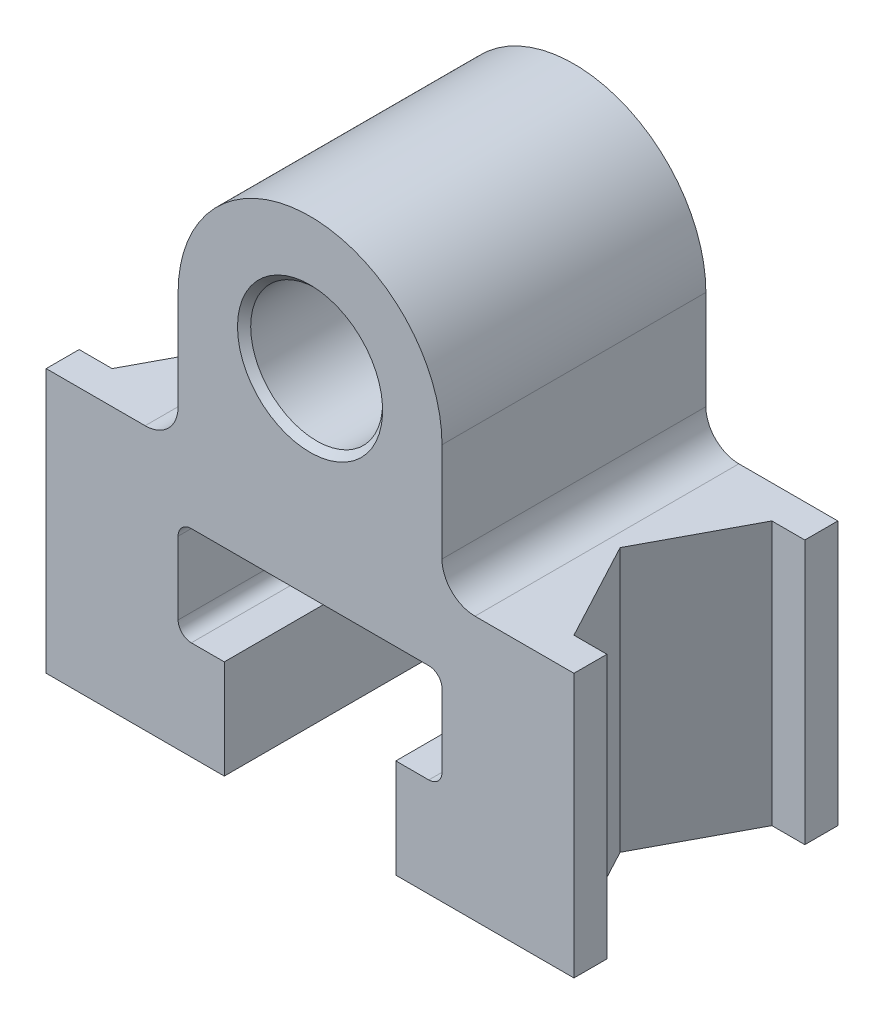
ISO-10303-21;
HEADER;
FILE_DESCRIPTION(('STEP AP214'),'2;1');
FILE_NAME('part.step','',(''),(''),'','','');
FILE_SCHEMA(('AUTOMOTIVE_DESIGN { 1 0 10303 214 1 1 1 1 }'));
ENDSEC;
DATA;
#1=APPLICATION_CONTEXT('core data for automotive mechanical design processes');
#2=APPLICATION_PROTOCOL_DEFINITION('international standard','automotive_design',2000,#1);
#3=PRODUCT_CONTEXT('',#1,'mechanical');
#4=PRODUCT('Part','Part','',(#3));
#5=PRODUCT_RELATED_PRODUCT_CATEGORY('part','',(#4));
#6=PRODUCT_DEFINITION_FORMATION('','',#4);
#7=PRODUCT_DEFINITION_CONTEXT('part definition',#1,'design');
#8=PRODUCT_DEFINITION('design','',#6,#7);
#9=PRODUCT_DEFINITION_SHAPE('','',#8);
#10=(LENGTH_UNIT() NAMED_UNIT(*) SI_UNIT(.MILLI.,.METRE.));
#11=(NAMED_UNIT(*) PLANE_ANGLE_UNIT() SI_UNIT($,.RADIAN.));
#12=(NAMED_UNIT(*) SI_UNIT($,.STERADIAN.) SOLID_ANGLE_UNIT());
#13=UNCERTAINTY_MEASURE_WITH_UNIT(LENGTH_MEASURE(1.E-05),#10,'distance_accuracy_value','');
#14=(GEOMETRIC_REPRESENTATION_CONTEXT(3) GLOBAL_UNCERTAINTY_ASSIGNED_CONTEXT((#13)) GLOBAL_UNIT_ASSIGNED_CONTEXT((#10,
#11,#12)) REPRESENTATION_CONTEXT('',''));
#15=CARTESIAN_POINT('',(0.,0.,0.));
#16=DIRECTION('',(0.,0.,1.));
#17=DIRECTION('',(1.,0.,0.));
#18=AXIS2_PLACEMENT_3D('',#15,#16,#17);
#19=CARTESIAN_POINT('',(0.,0.,0.));
#20=DIRECTION('',(0.,-1.,0.));
#21=DIRECTION('',(0.,0.,-1.));
#22=AXIS2_PLACEMENT_3D('',#19,#20,#21);
#23=PLANE('',#22);
#24=DIRECTION('',(0.,0.,1.));
#25=VECTOR('',#24,1.);
#26=CARTESIAN_POINT('',(-13.,0.,-60.));
#27=LINE('',#26,#25);
#28=CARTESIAN_POINT('',(-13.,0.,-20.));
#29=VERTEX_POINT('',#28);
#30=CARTESIAN_POINT('',(-13.,0.,20.));
#31=VERTEX_POINT('',#30);
#32=EDGE_CURVE('E889',#29,#31,#27,.T.);
#33=ORIENTED_EDGE('',*,*,#32,.T.);
#34=DIRECTION('',(1.,0.,0.));
#35=VECTOR('',#34,1.);
#36=CARTESIAN_POINT('',(-40.,0.,20.));
#37=LINE('',#36,#35);
#38=CARTESIAN_POINT('',(-40.,0.,20.));
#39=VERTEX_POINT('',#38);
#40=EDGE_CURVE('E276',#39,#31,#37,.T.);
#41=ORIENTED_EDGE('',*,*,#40,.F.);
#42=DIRECTION('',(0.,0.,1.));
#43=VECTOR('',#42,1.);
#44=CARTESIAN_POINT('',(-40.,0.,20.));
#45=LINE('',#44,#43);
#46=CARTESIAN_POINT('',(-40.,0.,15.));
#47=VERTEX_POINT('',#46);
#48=EDGE_CURVE('E281',#47,#39,#45,.T.);
#49=ORIENTED_EDGE('',*,*,#48,.F.);
#50=DIRECTION('',(1.,0.,0.));
#51=VECTOR('',#50,1.);
#52=CARTESIAN_POINT('',(0.,0.,15.));
#53=LINE('',#52,#51);
#54=CARTESIAN_POINT('',(-35.,0.,15.));
#55=VERTEX_POINT('',#54);
#56=EDGE_CURVE('E910',#47,#55,#53,.T.);
#57=ORIENTED_EDGE('',*,*,#56,.T.);
#58=DIRECTION('',(0.470588235294118,0.,-0.882352941176471));
#59=VECTOR('',#58,1.);
#60=CARTESIAN_POINT('',(-21.0207612456747,0.,-11.2110726643599));
#61=LINE('',#60,#59);
#62=CARTESIAN_POINT('',(-27.,0.,0.));
#63=VERTEX_POINT('',#62);
#64=EDGE_CURVE('E450',#55,#63,#61,.T.);
#65=ORIENTED_EDGE('',*,*,#64,.T.);
#66=DIRECTION('',(-0.470588235294118,0.,-0.882352941176471));
#67=VECTOR('',#66,1.);
#68=CARTESIAN_POINT('',(-21.0207612456748,0.,11.2110726643599));
#69=LINE('',#68,#67);
#70=CARTESIAN_POINT('',(-35.,0.,-15.));
#71=VERTEX_POINT('',#70);
#72=EDGE_CURVE('E443',#63,#71,#69,.T.);
#73=ORIENTED_EDGE('',*,*,#72,.T.);
#74=DIRECTION('',(-1.,0.,0.));
#75=VECTOR('',#74,1.);
#76=CARTESIAN_POINT('',(0.,0.,-15.));
#77=LINE('',#76,#75);
#78=CARTESIAN_POINT('',(-40.,0.,-15.));
#79=VERTEX_POINT('',#78);
#80=EDGE_CURVE('E441',#71,#79,#77,.T.);
#81=ORIENTED_EDGE('',*,*,#80,.T.);
#82=CARTESIAN_POINT('',(-40.,0.,-20.));
#83=VERTEX_POINT('',#82);
#84=EDGE_CURVE('E277',#83,#79,#45,.T.);
#85=ORIENTED_EDGE('',*,*,#84,.F.);
#86=DIRECTION('',(-1.,0.,0.));
#87=VECTOR('',#86,1.);
#88=CARTESIAN_POINT('',(-40.,0.,-20.));
#89=LINE('',#88,#87);
#90=EDGE_CURVE('E426',#29,#83,#89,.T.);
#91=ORIENTED_EDGE('',*,*,#90,.F.);
#92=EDGE_LOOP('',(#33,#41,#49,#57,#65,#73,#81,#85,#91));
#93=FACE_BOUND('',#92,.T.);
#94=ADVANCED_FACE('F41',(#93),#23,.T.);
#95=CARTESIAN_POINT('',(-40.,80.,20.));
#96=DIRECTION('',(1.,0.,0.));
#97=DIRECTION('',(0.,0.,-1.));
#98=AXIS2_PLACEMENT_3D('',#95,#96,#97);
#99=PLANE('',#98);
#100=DIRECTION('',(0.,1.,0.));
#101=VECTOR('',#100,1.);
#102=CARTESIAN_POINT('',(-40.,-40.,-15.));
#103=LINE('',#102,#101);
#104=CARTESIAN_POINT('',(-40.,40.,-15.));
#105=VERTEX_POINT('',#104);
#106=EDGE_CURVE('E907',#79,#105,#103,.T.);
#107=ORIENTED_EDGE('',*,*,#106,.T.);
#108=DIRECTION('',(0.,0.,1.));
#109=VECTOR('',#108,1.);
#110=CARTESIAN_POINT('',(-40.,40.,-60.));
#111=LINE('',#110,#109);
#112=CARTESIAN_POINT('',(-40.,40.,-20.));
#113=VERTEX_POINT('',#112);
#114=EDGE_CURVE('E422',#113,#105,#111,.T.);
#115=ORIENTED_EDGE('',*,*,#114,.F.);
#116=DIRECTION('',(0.,-1.,0.));
#117=VECTOR('',#116,1.);
#118=CARTESIAN_POINT('',(-40.,80.,-20.));
#119=LINE('',#118,#117);
#120=EDGE_CURVE('E289',#113,#83,#119,.T.);
#121=ORIENTED_EDGE('',*,*,#120,.T.);
#122=ORIENTED_EDGE('',*,*,#84,.T.);
#123=EDGE_LOOP('',(#107,#115,#121,#122));
#124=FACE_BOUND('',#123,.T.);
#125=ADVANCED_FACE('F437',(#124),#99,.F.);
#126=DIRECTION('',(0.,1.,0.));
#127=VECTOR('',#126,1.);
#128=CARTESIAN_POINT('',(-40.,-40.,15.));
#129=LINE('',#128,#127);
#130=CARTESIAN_POINT('',(-40.,40.,15.));
#131=VERTEX_POINT('',#130);
#132=EDGE_CURVE('E915',#47,#131,#129,.T.);
#133=ORIENTED_EDGE('',*,*,#132,.F.);
#134=ORIENTED_EDGE('',*,*,#48,.T.);
#135=DIRECTION('',(0.,-1.,0.));
#136=VECTOR('',#135,1.);
#137=CARTESIAN_POINT('',(-40.,80.,20.));
#138=LINE('',#137,#136);
#139=CARTESIAN_POINT('',(-40.,40.,20.));
#140=VERTEX_POINT('',#139);
#141=EDGE_CURVE('E286',#140,#39,#138,.T.);
#142=ORIENTED_EDGE('',*,*,#141,.F.);
#143=EDGE_CURVE('E483',#131,#140,#111,.T.);
#144=ORIENTED_EDGE('',*,*,#143,.F.);
#145=EDGE_LOOP('',(#133,#134,#142,#144));
#146=FACE_BOUND('',#145,.T.);
#147=ADVANCED_FACE('F531',(#146),#99,.F.);
#148=DIRECTION('',(0.,0.,1.));
#149=VECTOR('',#148,1.);
#150=CARTESIAN_POINT('',(13.,0.,-60.));
#151=LINE('',#150,#149);
#152=CARTESIAN_POINT('',(13.,0.,-20.));
#153=VERTEX_POINT('',#152);
#154=CARTESIAN_POINT('',(13.,0.,20.));
#155=VERTEX_POINT('',#154);
#156=EDGE_CURVE('E249',#153,#155,#151,.T.);
#157=ORIENTED_EDGE('',*,*,#156,.F.);
#158=CARTESIAN_POINT('',(40.,0.,-20.));
#159=VERTEX_POINT('',#158);
#160=EDGE_CURVE('E427',#159,#153,#89,.T.);
#161=ORIENTED_EDGE('',*,*,#160,.F.);
#162=DIRECTION('',(0.,0.,-1.));
#163=VECTOR('',#162,1.);
#164=CARTESIAN_POINT('',(40.,0.,20.));
#165=LINE('',#164,#163);
#166=CARTESIAN_POINT('',(40.,0.,-15.));
#167=VERTEX_POINT('',#166);
#168=EDGE_CURVE('E425',#167,#159,#165,.T.);
#169=ORIENTED_EDGE('',*,*,#168,.F.);
#170=DIRECTION('',(1.,0.,0.));
#171=VECTOR('',#170,1.);
#172=CARTESIAN_POINT('',(0.,0.,-15.));
#173=LINE('',#172,#171);
#174=CARTESIAN_POINT('',(35.,0.,-15.));
#175=VERTEX_POINT('',#174);
#176=EDGE_CURVE('E479',#175,#167,#173,.T.);
#177=ORIENTED_EDGE('',*,*,#176,.F.);
#178=DIRECTION('',(0.470588235294118,0.,-0.882352941176471));
#179=VECTOR('',#178,1.);
#180=CARTESIAN_POINT('',(21.0207612456748,0.,11.2110726643599));
#181=LINE('',#180,#179);
#182=CARTESIAN_POINT('',(27.,0.,0.));
#183=VERTEX_POINT('',#182);
#184=EDGE_CURVE('E464',#183,#175,#181,.T.);
#185=ORIENTED_EDGE('',*,*,#184,.F.);
#186=DIRECTION('',(-0.470588235294118,0.,-0.882352941176471));
#187=VECTOR('',#186,1.);
#188=CARTESIAN_POINT('',(21.0207612456747,0.,-11.2110726643599));
#189=LINE('',#188,#187);
#190=CARTESIAN_POINT('',(35.,0.,15.));
#191=VERTEX_POINT('',#190);
#192=EDGE_CURVE('E475',#191,#183,#189,.T.);
#193=ORIENTED_EDGE('',*,*,#192,.F.);
#194=DIRECTION('',(-1.,0.,0.));
#195=VECTOR('',#194,1.);
#196=CARTESIAN_POINT('',(0.,0.,15.));
#197=LINE('',#196,#195);
#198=CARTESIAN_POINT('',(40.,0.,15.));
#199=VERTEX_POINT('',#198);
#200=EDGE_CURVE('E477',#199,#191,#197,.T.);
#201=ORIENTED_EDGE('',*,*,#200,.F.);
#202=CARTESIAN_POINT('',(40.,0.,20.));
#203=VERTEX_POINT('',#202);
#204=EDGE_CURVE('E275',#203,#199,#165,.T.);
#205=ORIENTED_EDGE('',*,*,#204,.F.);
#206=EDGE_CURVE('E266',#155,#203,#37,.T.);
#207=ORIENTED_EDGE('',*,*,#206,.F.);
#208=EDGE_LOOP('',(#157,#161,#169,#177,#185,#193,#201,#205,#207));
#209=FACE_BOUND('',#208,.T.);
#210=ADVANCED_FACE('F272',(#209),#23,.T.);
#211=CARTESIAN_POINT('',(-40.,40.,-60.));
#212=DIRECTION('',(0.,-1.,0.));
#213=DIRECTION('',(0.,0.,-1.));
#214=AXIS2_PLACEMENT_3D('',#211,#212,#213);
#215=PLANE('',#214);
#216=DIRECTION('',(1.,0.,0.));
#217=VECTOR('',#216,1.);
#218=CARTESIAN_POINT('',(-40.,40.,20.));
#219=LINE('',#218,#217);
#220=CARTESIAN_POINT('',(-25.,40.,20.));
#221=VERTEX_POINT('',#220);
#222=EDGE_CURVE('E414',#140,#221,#219,.T.);
#223=ORIENTED_EDGE('',*,*,#222,.T.);
#224=DIRECTION('',(0.,0.,1.));
#225=VECTOR('',#224,1.);
#226=CARTESIAN_POINT('',(-25.,40.,-20.));
#227=LINE('',#226,#225);
#228=CARTESIAN_POINT('',(-25.,40.,-20.));
#229=VERTEX_POINT('',#228);
#230=EDGE_CURVE('E56',#221,#229,#227,.F.);
#231=ORIENTED_EDGE('',*,*,#230,.T.);
#232=DIRECTION('',(1.,0.,0.));
#233=VECTOR('',#232,1.);
#234=CARTESIAN_POINT('',(-40.,40.,-20.));
#235=LINE('',#234,#233);
#236=EDGE_CURVE('E403',#113,#229,#235,.T.);
#237=ORIENTED_EDGE('',*,*,#236,.F.);
#238=ORIENTED_EDGE('',*,*,#114,.T.);
#239=DIRECTION('',(1.,0.,0.));
#240=VECTOR('',#239,1.);
#241=CARTESIAN_POINT('',(-40.,40.,-15.));
#242=LINE('',#241,#240);
#243=CARTESIAN_POINT('',(-35.,40.,-15.));
#244=VERTEX_POINT('',#243);
#245=EDGE_CURVE('E891',#105,#244,#242,.T.);
#246=ORIENTED_EDGE('',*,*,#245,.T.);
#247=DIRECTION('',(0.470588235294118,0.,0.882352941176471));
#248=VECTOR('',#247,1.);
#249=CARTESIAN_POINT('',(-35.,40.,-15.));
#250=LINE('',#249,#248);
#251=CARTESIAN_POINT('',(-27.,40.,0.));
#252=VERTEX_POINT('',#251);
#253=EDGE_CURVE('E904',#244,#252,#250,.T.);
#254=ORIENTED_EDGE('',*,*,#253,.T.);
#255=DIRECTION('',(-0.470588235294118,0.,0.882352941176471));
#256=VECTOR('',#255,1.);
#257=CARTESIAN_POINT('',(-27.,40.,0.));
#258=LINE('',#257,#256);
#259=CARTESIAN_POINT('',(-35.,40.,15.));
#260=VERTEX_POINT('',#259);
#261=EDGE_CURVE('E901',#252,#260,#258,.T.);
#262=ORIENTED_EDGE('',*,*,#261,.T.);
#263=DIRECTION('',(-1.,0.,0.));
#264=VECTOR('',#263,1.);
#265=CARTESIAN_POINT('',(-35.,40.,15.));
#266=LINE('',#265,#264);
#267=EDGE_CURVE('E898',#260,#131,#266,.T.);
#268=ORIENTED_EDGE('',*,*,#267,.T.);
#269=ORIENTED_EDGE('',*,*,#143,.T.);
#270=EDGE_LOOP('',(#223,#231,#237,#238,#246,#254,#262,#268,#269));
#271=FACE_BOUND('',#270,.T.);
#272=ADVANCED_FACE('F510',(#271),#215,.F.);
#273=CARTESIAN_POINT('',(40.,80.,20.));
#274=DIRECTION('',(-1.,0.,0.));
#275=DIRECTION('',(0.,0.,1.));
#276=AXIS2_PLACEMENT_3D('',#273,#274,#275);
#277=PLANE('',#276);
#278=DIRECTION('',(0.,0.,1.));
#279=VECTOR('',#278,1.);
#280=CARTESIAN_POINT('',(40.,40.,-60.));
#281=LINE('',#280,#279);
#282=CARTESIAN_POINT('',(40.,40.,-20.));
#283=VERTEX_POINT('',#282);
#284=CARTESIAN_POINT('',(40.,40.,-15.));
#285=VERTEX_POINT('',#284);
#286=EDGE_CURVE('E401',#283,#285,#281,.T.);
#287=ORIENTED_EDGE('',*,*,#286,.T.);
#288=DIRECTION('',(0.,1.,0.));
#289=VECTOR('',#288,1.);
#290=CARTESIAN_POINT('',(40.,-40.,-15.));
#291=LINE('',#290,#289);
#292=EDGE_CURVE('E462',#167,#285,#291,.T.);
#293=ORIENTED_EDGE('',*,*,#292,.F.);
#294=ORIENTED_EDGE('',*,*,#168,.T.);
#295=DIRECTION('',(0.,-1.,0.));
#296=VECTOR('',#295,1.);
#297=CARTESIAN_POINT('',(40.,80.,-20.));
#298=LINE('',#297,#296);
#299=EDGE_CURVE('E292',#283,#159,#298,.T.);
#300=ORIENTED_EDGE('',*,*,#299,.F.);
#301=EDGE_LOOP('',(#287,#293,#294,#300));
#302=FACE_BOUND('',#301,.T.);
#303=ADVANCED_FACE('F508',(#302),#277,.F.);
#304=CARTESIAN_POINT('',(-40.,80.,20.));
#305=DIRECTION('',(0.,0.,-1.));
#306=DIRECTION('',(-1.,0.,0.));
#307=AXIS2_PLACEMENT_3D('',#304,#305,#306);
#308=PLANE('',#307);
#309=CARTESIAN_POINT('',(0.,60.,20.));
#310=DIRECTION('',(0.,0.,-1.));
#311=DIRECTION('',(-1.,0.,0.));
#312=AXIS2_PLACEMENT_3D('',#309,#310,#311);
#313=CIRCLE('',#312,11.);
#314=CARTESIAN_POINT('',(-11.,60.,20.));
#315=VERTEX_POINT('',#314);
#316=EDGE_CURVE('E315',#315,#315,#313,.T.);
#317=ORIENTED_EDGE('',*,*,#316,.T.);
#318=EDGE_LOOP('',(#317));
#319=FACE_BOUND('',#318,.T.);
#320=ORIENTED_EDGE('',*,*,#40,.T.);
#321=DIRECTION('',(0.,-1.,0.));
#322=VECTOR('',#321,1.);
#323=CARTESIAN_POINT('',(-13.,0.,20.));
#324=LINE('',#323,#322);
#325=CARTESIAN_POINT('',(-13.,15.,20.));
#326=VERTEX_POINT('',#325);
#327=EDGE_CURVE('E261',#326,#31,#324,.T.);
#328=ORIENTED_EDGE('',*,*,#327,.F.);
#329=DIRECTION('',(1.,0.,0.));
#330=VECTOR('',#329,1.);
#331=CARTESIAN_POINT('',(-13.,15.,20.));
#332=LINE('',#331,#330);
#333=CARTESIAN_POINT('',(-18.,15.,20.));
#334=VERTEX_POINT('',#333);
#335=EDGE_CURVE('E887',#334,#326,#332,.T.);
#336=ORIENTED_EDGE('',*,*,#335,.F.);
#337=CARTESIAN_POINT('',(-18.,17.,20.));
#338=DIRECTION('',(0.,0.,-1.));
#339=DIRECTION('',(-1.,0.,0.));
#340=AXIS2_PLACEMENT_3D('',#337,#338,#339);
#341=CIRCLE('',#340,2.);
#342=CARTESIAN_POINT('',(-20.,17.,20.));
#343=VERTEX_POINT('',#342);
#344=EDGE_CURVE('E356',#334,#343,#341,.T.);
#345=ORIENTED_EDGE('',*,*,#344,.T.);
#346=DIRECTION('',(0.,-1.,0.));
#347=VECTOR('',#346,1.);
#348=CARTESIAN_POINT('',(-20.,15.,20.));
#349=LINE('',#348,#347);
#350=CARTESIAN_POINT('',(-20.,28.,20.));
#351=VERTEX_POINT('',#350);
#352=EDGE_CURVE('E880',#351,#343,#349,.T.);
#353=ORIENTED_EDGE('',*,*,#352,.F.);
#354=CARTESIAN_POINT('',(-18.,28.,20.));
#355=DIRECTION('',(0.,0.,-1.));
#356=DIRECTION('',(-1.,0.,0.));
#357=AXIS2_PLACEMENT_3D('',#354,#355,#356);
#358=CIRCLE('',#357,2.);
#359=CARTESIAN_POINT('',(-18.,30.,20.));
#360=VERTEX_POINT('',#359);
#361=EDGE_CURVE('E360',#351,#360,#358,.T.);
#362=ORIENTED_EDGE('',*,*,#361,.T.);
#363=DIRECTION('',(-1.,0.,0.));
#364=VECTOR('',#363,1.);
#365=CARTESIAN_POINT('',(-20.,30.,20.));
#366=LINE('',#365,#364);
#367=CARTESIAN_POINT('',(18.,30.,20.));
#368=VERTEX_POINT('',#367);
#369=EDGE_CURVE('E873',#368,#360,#366,.T.);
#370=ORIENTED_EDGE('',*,*,#369,.F.);
#371=CARTESIAN_POINT('',(18.,28.,20.));
#372=DIRECTION('',(0.,0.,-1.));
#373=DIRECTION('',(-1.,0.,0.));
#374=AXIS2_PLACEMENT_3D('',#371,#372,#373);
#375=CIRCLE('',#374,2.);
#376=CARTESIAN_POINT('',(20.,28.,20.));
#377=VERTEX_POINT('',#376);
#378=EDGE_CURVE('E368',#368,#377,#375,.T.);
#379=ORIENTED_EDGE('',*,*,#378,.T.);
#380=DIRECTION('',(0.,1.,0.));
#381=VECTOR('',#380,1.);
#382=CARTESIAN_POINT('',(20.,30.,20.));
#383=LINE('',#382,#381);
#384=CARTESIAN_POINT('',(20.,17.,20.));
#385=VERTEX_POINT('',#384);
#386=EDGE_CURVE('E858',#385,#377,#383,.T.);
#387=ORIENTED_EDGE('',*,*,#386,.F.);
#388=CARTESIAN_POINT('',(18.,17.,20.));
#389=DIRECTION('',(0.,0.,-1.));
#390=DIRECTION('',(-1.,0.,0.));
#391=AXIS2_PLACEMENT_3D('',#388,#389,#390);
#392=CIRCLE('',#391,2.);
#393=CARTESIAN_POINT('',(18.,15.,20.));
#394=VERTEX_POINT('',#393);
#395=EDGE_CURVE('E364',#385,#394,#392,.T.);
#396=ORIENTED_EDGE('',*,*,#395,.T.);
#397=DIRECTION('',(1.,0.,0.));
#398=VECTOR('',#397,1.);
#399=CARTESIAN_POINT('',(20.,15.,20.));
#400=LINE('',#399,#398);
#401=CARTESIAN_POINT('',(13.,15.,20.));
#402=VERTEX_POINT('',#401);
#403=EDGE_CURVE('E269',#402,#394,#400,.T.);
#404=ORIENTED_EDGE('',*,*,#403,.F.);
#405=DIRECTION('',(0.,1.,0.));
#406=VECTOR('',#405,1.);
#407=CARTESIAN_POINT('',(13.,15.,20.));
#408=LINE('',#407,#406);
#409=EDGE_CURVE('E252',#155,#402,#408,.T.);
#410=ORIENTED_EDGE('',*,*,#409,.F.);
#411=ORIENTED_EDGE('',*,*,#206,.T.);
#412=DIRECTION('',(0.,-1.,0.));
#413=VECTOR('',#412,1.);
#414=CARTESIAN_POINT('',(40.,80.,20.));
#415=LINE('',#414,#413);
#416=CARTESIAN_POINT('',(40.,40.,20.));
#417=VERTEX_POINT('',#416);
#418=EDGE_CURVE('E279',#417,#203,#415,.T.);
#419=ORIENTED_EDGE('',*,*,#418,.F.);
#420=DIRECTION('',(1.,0.,0.));
#421=VECTOR('',#420,1.);
#422=CARTESIAN_POINT('',(40.,40.,20.));
#423=LINE('',#422,#421);
#424=CARTESIAN_POINT('',(25.,40.,20.));
#425=VERTEX_POINT('',#424);
#426=EDGE_CURVE('E410',#425,#417,#423,.T.);
#427=ORIENTED_EDGE('',*,*,#426,.F.);
#428=CARTESIAN_POINT('',(25.,45.,20.));
#429=DIRECTION('',(0.,0.,-1.));
#430=DIRECTION('',(-1.,0.,0.));
#431=AXIS2_PLACEMENT_3D('',#428,#429,#430);
#432=CIRCLE('',#431,5.);
#433=CARTESIAN_POINT('',(20.,45.,20.));
#434=VERTEX_POINT('',#433);
#435=EDGE_CURVE('E381',#425,#434,#432,.T.);
#436=ORIENTED_EDGE('',*,*,#435,.T.);
#437=DIRECTION('',(0.,-1.,0.));
#438=VECTOR('',#437,1.);
#439=CARTESIAN_POINT('',(20.,80.,20.));
#440=LINE('',#439,#438);
#441=CARTESIAN_POINT('',(20.,60.,20.));
#442=VERTEX_POINT('',#441);
#443=EDGE_CURVE('E409',#442,#434,#440,.T.);
#444=ORIENTED_EDGE('',*,*,#443,.F.);
#445=CARTESIAN_POINT('',(0.,60.,20.));
#446=DIRECTION('',(0.,0.,-1.));
#447=DIRECTION('',(-1.,0.,0.));
#448=AXIS2_PLACEMENT_3D('',#445,#446,#447);
#449=CIRCLE('',#448,20.);
#450=CARTESIAN_POINT('',(-20.,60.,20.));
#451=VERTEX_POINT('',#450);
#452=EDGE_CURVE('E303',#442,#451,#449,.F.);
#453=ORIENTED_EDGE('',*,*,#452,.T.);
#454=DIRECTION('',(0.,1.,0.));
#455=VECTOR('',#454,1.);
#456=CARTESIAN_POINT('',(-20.,80.,20.));
#457=LINE('',#456,#455);
#458=CARTESIAN_POINT('',(-20.,45.,20.));
#459=VERTEX_POINT('',#458);
#460=EDGE_CURVE('E416',#459,#451,#457,.T.);
#461=ORIENTED_EDGE('',*,*,#460,.F.);
#462=CARTESIAN_POINT('',(-25.,45.,20.));
#463=DIRECTION('',(0.,0.,-1.));
#464=DIRECTION('',(-1.,0.,0.));
#465=AXIS2_PLACEMENT_3D('',#462,#463,#464);
#466=CIRCLE('',#465,5.);
#467=EDGE_CURVE('E49',#459,#221,#466,.T.);
#468=ORIENTED_EDGE('',*,*,#467,.T.);
#469=ORIENTED_EDGE('',*,*,#222,.F.);
#470=ORIENTED_EDGE('',*,*,#141,.T.);
#471=EDGE_LOOP('',(#320,#328,#336,#345,#353,#362,#370,#379,#387,#396,#404,#410,#411,#419,#427,
#436,#444,#453,#461,#468,#469,#470));
#472=FACE_BOUND('',#471,.T.);
#473=ADVANCED_FACE('F264',(#319,#472),#308,.F.);
#474=CARTESIAN_POINT('',(0.,60.,-20.));
#475=DIRECTION('',(0.,0.,-1.));
#476=DIRECTION('',(-1.,0.,0.));
#477=AXIS2_PLACEMENT_3D('',#474,#475,#476);
#478=CYLINDRICAL_SURFACE('',#477,20.);
#479=DIRECTION('',(0.,0.,-1.));
#480=VECTOR('',#479,1.);
#481=CARTESIAN_POINT('',(20.,60.,-60.));
#482=LINE('',#481,#480);
#483=CARTESIAN_POINT('',(20.,60.,-20.));
#484=VERTEX_POINT('',#483);
#485=EDGE_CURVE('E295',#484,#442,#482,.F.);
#486=ORIENTED_EDGE('',*,*,#485,.F.);
#487=CARTESIAN_POINT('',(0.,60.,-20.));
#488=DIRECTION('',(0.,0.,1.));
#489=DIRECTION('',(1.,0.,0.));
#490=AXIS2_PLACEMENT_3D('',#487,#488,#489);
#491=CIRCLE('',#490,20.);
#492=CARTESIAN_POINT('',(-20.,60.,-20.));
#493=VERTEX_POINT('',#492);
#494=EDGE_CURVE('E301',#493,#484,#491,.F.);
#495=ORIENTED_EDGE('',*,*,#494,.F.);
#496=DIRECTION('',(0.,0.,-1.));
#497=VECTOR('',#496,1.);
#498=CARTESIAN_POINT('',(-20.,60.,-60.));
#499=LINE('',#498,#497);
#500=EDGE_CURVE('E298',#451,#493,#499,.T.);
#501=ORIENTED_EDGE('',*,*,#500,.F.);
#502=ORIENTED_EDGE('',*,*,#452,.F.);
#503=EDGE_LOOP('',(#486,#495,#501,#502));
#504=FACE_BOUND('',#503,.T.);
#505=ADVANCED_FACE('F517',(#504),#478,.T.);
#506=ORIENTED_EDGE('',*,*,#204,.T.);
#507=DIRECTION('',(0.,1.,0.));
#508=VECTOR('',#507,1.);
#509=CARTESIAN_POINT('',(40.,-40.,15.));
#510=LINE('',#509,#508);
#511=CARTESIAN_POINT('',(40.,40.,15.));
#512=VERTEX_POINT('',#511);
#513=EDGE_CURVE('E465',#199,#512,#510,.T.);
#514=ORIENTED_EDGE('',*,*,#513,.T.);
#515=EDGE_CURVE('E480',#512,#417,#281,.T.);
#516=ORIENTED_EDGE('',*,*,#515,.T.);
#517=ORIENTED_EDGE('',*,*,#418,.T.);
#518=EDGE_LOOP('',(#506,#514,#516,#517));
#519=FACE_BOUND('',#518,.T.);
#520=ADVANCED_FACE('F489',(#519),#277,.F.);
#521=CARTESIAN_POINT('',(-40.,80.,-20.));
#522=DIRECTION('',(0.,0.,1.));
#523=DIRECTION('',(1.,0.,0.));
#524=AXIS2_PLACEMENT_3D('',#521,#522,#523);
#525=PLANE('',#524);
#526=CARTESIAN_POINT('',(0.,60.,-20.));
#527=DIRECTION('',(0.,0.,1.));
#528=DIRECTION('',(1.,0.,0.));
#529=AXIS2_PLACEMENT_3D('',#526,#527,#528);
#530=CIRCLE('',#529,11.);
#531=CARTESIAN_POINT('',(11.,60.,-20.));
#532=VERTEX_POINT('',#531);
#533=EDGE_CURVE('E306',#532,#532,#530,.T.);
#534=ORIENTED_EDGE('',*,*,#533,.T.);
#535=EDGE_LOOP('',(#534));
#536=FACE_BOUND('',#535,.T.);
#537=DIRECTION('',(0.,-1.,0.));
#538=VECTOR('',#537,1.);
#539=CARTESIAN_POINT('',(-20.,80.,-20.));
#540=LINE('',#539,#538);
#541=CARTESIAN_POINT('',(-20.,28.,-20.));
#542=VERTEX_POINT('',#541);
#543=CARTESIAN_POINT('',(-20.,17.,-20.));
#544=VERTEX_POINT('',#543);
#545=EDGE_CURVE('E328',#542,#544,#540,.T.);
#546=ORIENTED_EDGE('',*,*,#545,.T.);
#547=CARTESIAN_POINT('',(-18.,17.,-20.));
#548=DIRECTION('',(0.,0.,1.));
#549=DIRECTION('',(1.,0.,0.));
#550=AXIS2_PLACEMENT_3D('',#547,#548,#549);
#551=CIRCLE('',#550,2.);
#552=CARTESIAN_POINT('',(-18.,15.,-20.));
#553=VERTEX_POINT('',#552);
#554=EDGE_CURVE('E358',#544,#553,#551,.T.);
#555=ORIENTED_EDGE('',*,*,#554,.T.);
#556=DIRECTION('',(1.,0.,0.));
#557=VECTOR('',#556,1.);
#558=CARTESIAN_POINT('',(-40.,15.,-20.));
#559=LINE('',#558,#557);
#560=CARTESIAN_POINT('',(-13.,15.,-20.));
#561=VERTEX_POINT('',#560);
#562=EDGE_CURVE('E331',#553,#561,#559,.T.);
#563=ORIENTED_EDGE('',*,*,#562,.T.);
#564=DIRECTION('',(0.,-1.,0.));
#565=VECTOR('',#564,1.);
#566=CARTESIAN_POINT('',(-13.,80.,-20.));
#567=LINE('',#566,#565);
#568=EDGE_CURVE('E333',#561,#29,#567,.T.);
#569=ORIENTED_EDGE('',*,*,#568,.T.);
#570=ORIENTED_EDGE('',*,*,#90,.T.);
#571=ORIENTED_EDGE('',*,*,#120,.F.);
#572=ORIENTED_EDGE('',*,*,#236,.T.);
#573=CARTESIAN_POINT('',(-25.,45.,-20.));
#574=DIRECTION('',(0.,0.,1.));
#575=DIRECTION('',(1.,0.,0.));
#576=AXIS2_PLACEMENT_3D('',#573,#574,#575);
#577=CIRCLE('',#576,5.);
#578=CARTESIAN_POINT('',(-20.,45.,-20.));
#579=VERTEX_POINT('',#578);
#580=EDGE_CURVE('E11',#229,#579,#577,.T.);
#581=ORIENTED_EDGE('',*,*,#580,.T.);
#582=DIRECTION('',(0.,1.,0.));
#583=VECTOR('',#582,1.);
#584=CARTESIAN_POINT('',(-20.,80.,-20.));
#585=LINE('',#584,#583);
#586=EDGE_CURVE('E404',#579,#493,#585,.T.);
#587=ORIENTED_EDGE('',*,*,#586,.T.);
#588=ORIENTED_EDGE('',*,*,#494,.T.);
#589=DIRECTION('',(0.,-1.,0.));
#590=VECTOR('',#589,1.);
#591=CARTESIAN_POINT('',(20.,80.,-20.));
#592=LINE('',#591,#590);
#593=CARTESIAN_POINT('',(20.,45.,-20.));
#594=VERTEX_POINT('',#593);
#595=EDGE_CURVE('E392',#484,#594,#592,.T.);
#596=ORIENTED_EDGE('',*,*,#595,.T.);
#597=CARTESIAN_POINT('',(25.,45.,-20.));
#598=DIRECTION('',(0.,0.,1.));
#599=DIRECTION('',(1.,0.,0.));
#600=AXIS2_PLACEMENT_3D('',#597,#598,#599);
#601=CIRCLE('',#600,5.);
#602=CARTESIAN_POINT('',(25.,40.,-20.));
#603=VERTEX_POINT('',#602);
#604=EDGE_CURVE('E383',#594,#603,#601,.T.);
#605=ORIENTED_EDGE('',*,*,#604,.T.);
#606=DIRECTION('',(1.,0.,0.));
#607=VECTOR('',#606,1.);
#608=CARTESIAN_POINT('',(-40.,40.,-20.));
#609=LINE('',#608,#607);
#610=EDGE_CURVE('E389',#603,#283,#609,.T.);
#611=ORIENTED_EDGE('',*,*,#610,.T.);
#612=ORIENTED_EDGE('',*,*,#299,.T.);
#613=ORIENTED_EDGE('',*,*,#160,.T.);
#614=DIRECTION('',(0.,1.,0.));
#615=VECTOR('',#614,1.);
#616=CARTESIAN_POINT('',(13.,80.,-20.));
#617=LINE('',#616,#615);
#618=CARTESIAN_POINT('',(13.,15.,-20.));
#619=VERTEX_POINT('',#618);
#620=EDGE_CURVE('E255',#153,#619,#617,.T.);
#621=ORIENTED_EDGE('',*,*,#620,.T.);
#622=DIRECTION('',(1.,0.,0.));
#623=VECTOR('',#622,1.);
#624=CARTESIAN_POINT('',(-40.,15.,-20.));
#625=LINE('',#624,#623);
#626=CARTESIAN_POINT('',(18.,15.,-20.));
#627=VERTEX_POINT('',#626);
#628=EDGE_CURVE('E319',#619,#627,#625,.T.);
#629=ORIENTED_EDGE('',*,*,#628,.T.);
#630=CARTESIAN_POINT('',(18.,17.,-20.));
#631=DIRECTION('',(0.,0.,1.));
#632=DIRECTION('',(1.,0.,0.));
#633=AXIS2_PLACEMENT_3D('',#630,#631,#632);
#634=CIRCLE('',#633,2.);
#635=CARTESIAN_POINT('',(20.,17.,-20.));
#636=VERTEX_POINT('',#635);
#637=EDGE_CURVE('E366',#627,#636,#634,.T.);
#638=ORIENTED_EDGE('',*,*,#637,.T.);
#639=DIRECTION('',(0.,1.,0.));
#640=VECTOR('',#639,1.);
#641=CARTESIAN_POINT('',(20.,80.,-20.));
#642=LINE('',#641,#640);
#643=CARTESIAN_POINT('',(20.,28.,-20.));
#644=VERTEX_POINT('',#643);
#645=EDGE_CURVE('E322',#636,#644,#642,.T.);
#646=ORIENTED_EDGE('',*,*,#645,.T.);
#647=CARTESIAN_POINT('',(18.,28.,-20.));
#648=DIRECTION('',(0.,0.,1.));
#649=DIRECTION('',(1.,0.,0.));
#650=AXIS2_PLACEMENT_3D('',#647,#648,#649);
#651=CIRCLE('',#650,2.);
#652=CARTESIAN_POINT('',(18.,30.,-20.));
#653=VERTEX_POINT('',#652);
#654=EDGE_CURVE('E370',#644,#653,#651,.T.);
#655=ORIENTED_EDGE('',*,*,#654,.T.);
#656=DIRECTION('',(-1.,0.,0.));
#657=VECTOR('',#656,1.);
#658=CARTESIAN_POINT('',(-40.,30.,-20.));
#659=LINE('',#658,#657);
#660=CARTESIAN_POINT('',(-18.,30.,-20.));
#661=VERTEX_POINT('',#660);
#662=EDGE_CURVE('E325',#653,#661,#659,.T.);
#663=ORIENTED_EDGE('',*,*,#662,.T.);
#664=CARTESIAN_POINT('',(-18.,28.,-20.));
#665=DIRECTION('',(0.,0.,1.));
#666=DIRECTION('',(1.,0.,0.));
#667=AXIS2_PLACEMENT_3D('',#664,#665,#666);
#668=CIRCLE('',#667,2.);
#669=EDGE_CURVE('E362',#661,#542,#668,.T.);
#670=ORIENTED_EDGE('',*,*,#669,.T.);
#671=EDGE_LOOP('',(#546,#555,#563,#569,#570,#571,#572,#581,#587,#588,#596,#605,#611,#612,#613,
#621,#629,#638,#646,#655,#663,#670));
#672=FACE_BOUND('',#671,.T.);
#673=ADVANCED_FACE('F388',(#536,#672),#525,.F.);
#674=CARTESIAN_POINT('',(40.,40.,-60.));
#675=DIRECTION('',(0.,-1.,0.));
#676=DIRECTION('',(0.,0.,-1.));
#677=AXIS2_PLACEMENT_3D('',#674,#675,#676);
#678=PLANE('',#677);
#679=ORIENTED_EDGE('',*,*,#610,.F.);
#680=DIRECTION('',(0.,0.,1.));
#681=VECTOR('',#680,1.);
#682=CARTESIAN_POINT('',(25.,40.,20.));
#683=LINE('',#682,#681);
#684=EDGE_CURVE('E372',#603,#425,#683,.T.);
#685=ORIENTED_EDGE('',*,*,#684,.T.);
#686=ORIENTED_EDGE('',*,*,#426,.T.);
#687=ORIENTED_EDGE('',*,*,#515,.F.);
#688=DIRECTION('',(1.,0.,0.));
#689=VECTOR('',#688,1.);
#690=CARTESIAN_POINT('',(35.,40.,15.));
#691=LINE('',#690,#689);
#692=CARTESIAN_POINT('',(35.,40.,15.));
#693=VERTEX_POINT('',#692);
#694=EDGE_CURVE('E459',#693,#512,#691,.T.);
#695=ORIENTED_EDGE('',*,*,#694,.F.);
#696=DIRECTION('',(0.470588235294118,0.,0.882352941176471));
#697=VECTOR('',#696,1.);
#698=CARTESIAN_POINT('',(27.,40.,0.));
#699=LINE('',#698,#697);
#700=CARTESIAN_POINT('',(27.,40.,0.));
#701=VERTEX_POINT('',#700);
#702=EDGE_CURVE('E456',#701,#693,#699,.T.);
#703=ORIENTED_EDGE('',*,*,#702,.F.);
#704=DIRECTION('',(-0.470588235294118,0.,0.882352941176471));
#705=VECTOR('',#704,1.);
#706=CARTESIAN_POINT('',(35.,40.,-15.));
#707=LINE('',#706,#705);
#708=CARTESIAN_POINT('',(35.,40.,-15.));
#709=VERTEX_POINT('',#708);
#710=EDGE_CURVE('E448',#709,#701,#707,.T.);
#711=ORIENTED_EDGE('',*,*,#710,.F.);
#712=DIRECTION('',(-1.,0.,0.));
#713=VECTOR('',#712,1.);
#714=CARTESIAN_POINT('',(40.,40.,-15.));
#715=LINE('',#714,#713);
#716=EDGE_CURVE('E446',#285,#709,#715,.T.);
#717=ORIENTED_EDGE('',*,*,#716,.F.);
#718=ORIENTED_EDGE('',*,*,#286,.F.);
#719=EDGE_LOOP('',(#679,#685,#686,#687,#695,#703,#711,#717,#718));
#720=FACE_BOUND('',#719,.T.);
#721=ADVANCED_FACE('F397',(#720),#678,.F.);
#722=CARTESIAN_POINT('',(20.,80.,-60.));
#723=DIRECTION('',(-1.,0.,0.));
#724=DIRECTION('',(0.,-1.,0.));
#725=AXIS2_PLACEMENT_3D('',#722,#723,#724);
#726=PLANE('',#725);
#727=ORIENTED_EDGE('',*,*,#443,.T.);
#728=DIRECTION('',(0.,0.,1.));
#729=VECTOR('',#728,1.);
#730=CARTESIAN_POINT('',(20.,45.,-20.));
#731=LINE('',#730,#729);
#732=EDGE_CURVE('E375',#434,#594,#731,.F.);
#733=ORIENTED_EDGE('',*,*,#732,.T.);
#734=ORIENTED_EDGE('',*,*,#595,.F.);
#735=ORIENTED_EDGE('',*,*,#485,.T.);
#736=EDGE_LOOP('',(#727,#733,#734,#735));
#737=FACE_BOUND('',#736,.T.);
#738=ADVANCED_FACE('F412',(#737),#726,.F.);
#739=CARTESIAN_POINT('',(-20.,80.,-60.));
#740=DIRECTION('',(1.,0.,0.));
#741=DIRECTION('',(0.,0.,-1.));
#742=AXIS2_PLACEMENT_3D('',#739,#740,#741);
#743=PLANE('',#742);
#744=ORIENTED_EDGE('',*,*,#586,.F.);
#745=DIRECTION('',(0.,0.,1.));
#746=VECTOR('',#745,1.);
#747=CARTESIAN_POINT('',(-20.,45.,20.));
#748=LINE('',#747,#746);
#749=EDGE_CURVE('E377',#579,#459,#748,.T.);
#750=ORIENTED_EDGE('',*,*,#749,.T.);
#751=ORIENTED_EDGE('',*,*,#460,.T.);
#752=ORIENTED_EDGE('',*,*,#500,.T.);
#753=EDGE_LOOP('',(#744,#750,#751,#752));
#754=FACE_BOUND('',#753,.T.);
#755=ADVANCED_FACE('F561',(#754),#743,.F.);
#756=CARTESIAN_POINT('',(0.,60.,20.));
#757=DIRECTION('',(0.,0.,1.));
#758=DIRECTION('',(1.,0.,0.));
#759=AXIS2_PLACEMENT_3D('',#756,#757,#758);
#760=CYLINDRICAL_SURFACE('',#759,9.99999999999999);
#761=CARTESIAN_POINT('',(0.,60.,-19.));
#762=DIRECTION('',(0.,0.,1.));
#763=DIRECTION('',(1.,0.,0.));
#764=AXIS2_PLACEMENT_3D('',#761,#762,#763);
#765=CIRCLE('',#764,9.99999999999999);
#766=CARTESIAN_POINT('',(9.99999999999999,60.,-19.));
#767=VERTEX_POINT('',#766);
#768=EDGE_CURVE('E312',#767,#767,#765,.F.);
#769=ORIENTED_EDGE('',*,*,#768,.T.);
#770=EDGE_LOOP('',(#769));
#771=FACE_BOUND('',#770,.T.);
#772=CARTESIAN_POINT('',(0.,60.,19.));
#773=DIRECTION('',(0.,0.,-1.));
#774=DIRECTION('',(-1.,0.,0.));
#775=AXIS2_PLACEMENT_3D('',#772,#773,#774);
#776=CIRCLE('',#775,9.99999999999999);
#777=CARTESIAN_POINT('',(-9.99999999999999,60.,19.));
#778=VERTEX_POINT('',#777);
#779=EDGE_CURVE('E309',#778,#778,#776,.F.);
#780=ORIENTED_EDGE('',*,*,#779,.T.);
#781=EDGE_LOOP('',(#780));
#782=FACE_BOUND('',#781,.T.);
#783=ADVANCED_FACE('F553',(#771,#782),#760,.F.);
#784=CARTESIAN_POINT('',(0.,60.,-20.));
#785=DIRECTION('',(0.,0.,-1.));
#786=DIRECTION('',(-1.,0.,0.));
#787=AXIS2_PLACEMENT_3D('',#784,#785,#786);
#788=CONICAL_SURFACE('',#787,11.,0.785398163397453);
#789=ORIENTED_EDGE('',*,*,#768,.F.);
#790=EDGE_LOOP('',(#789));
#791=FACE_BOUND('',#790,.T.);
#792=ORIENTED_EDGE('',*,*,#533,.F.);
#793=EDGE_LOOP('',(#792));
#794=FACE_BOUND('',#793,.T.);
#795=ADVANCED_FACE('F550',(#791,#794),#788,.F.);
#796=CARTESIAN_POINT('',(0.,60.,19.));
#797=DIRECTION('',(0.,0.,1.));
#798=DIRECTION('',(1.,0.,0.));
#799=AXIS2_PLACEMENT_3D('',#796,#797,#798);
#800=CONICAL_SURFACE('',#799,9.99999999999999,0.78539816339745);
#801=ORIENTED_EDGE('',*,*,#316,.F.);
#802=EDGE_LOOP('',(#801));
#803=FACE_BOUND('',#802,.T.);
#804=ORIENTED_EDGE('',*,*,#779,.F.);
#805=EDGE_LOOP('',(#804));
#806=FACE_BOUND('',#805,.T.);
#807=ADVANCED_FACE('F552',(#803,#806),#800,.F.);
#808=CARTESIAN_POINT('',(40.,-40.,-15.));
#809=DIRECTION('',(0.,0.,-1.));
#810=DIRECTION('',(-1.,0.,0.));
#811=AXIS2_PLACEMENT_3D('',#808,#809,#810);
#812=PLANE('',#811);
#813=ORIENTED_EDGE('',*,*,#176,.T.);
#814=ORIENTED_EDGE('',*,*,#292,.T.);
#815=ORIENTED_EDGE('',*,*,#716,.T.);
#816=DIRECTION('',(0.,1.,0.));
#817=VECTOR('',#816,1.);
#818=CARTESIAN_POINT('',(35.,-40.,-15.));
#819=LINE('',#818,#817);
#820=EDGE_CURVE('E461',#175,#709,#819,.T.);
#821=ORIENTED_EDGE('',*,*,#820,.F.);
#822=EDGE_LOOP('',(#813,#814,#815,#821));
#823=FACE_BOUND('',#822,.T.);
#824=ADVANCED_FACE('F505',(#823),#812,.F.);
#825=CARTESIAN_POINT('',(35.,-40.,15.));
#826=DIRECTION('',(0.,0.,1.));
#827=DIRECTION('',(1.,0.,0.));
#828=AXIS2_PLACEMENT_3D('',#825,#826,#827);
#829=PLANE('',#828);
#830=ORIENTED_EDGE('',*,*,#200,.T.);
#831=DIRECTION('',(0.,1.,0.));
#832=VECTOR('',#831,1.);
#833=CARTESIAN_POINT('',(35.,-40.,15.));
#834=LINE('',#833,#832);
#835=EDGE_CURVE('E468',#191,#693,#834,.T.);
#836=ORIENTED_EDGE('',*,*,#835,.T.);
#837=ORIENTED_EDGE('',*,*,#694,.T.);
#838=ORIENTED_EDGE('',*,*,#513,.F.);
#839=EDGE_LOOP('',(#830,#836,#837,#838));
#840=FACE_BOUND('',#839,.T.);
#841=ADVANCED_FACE('F494',(#840),#829,.F.);
#842=CARTESIAN_POINT('',(27.,-40.,0.));
#843=DIRECTION('',(-0.882352941176471,0.,0.470588235294118));
#844=DIRECTION('',(0.470588235294118,0.,0.882352941176471));
#845=AXIS2_PLACEMENT_3D('',#842,#843,#844);
#846=PLANE('',#845);
#847=ORIENTED_EDGE('',*,*,#192,.T.);
#848=DIRECTION('',(0.,1.,0.));
#849=VECTOR('',#848,1.);
#850=CARTESIAN_POINT('',(27.,-40.,0.));
#851=LINE('',#850,#849);
#852=EDGE_CURVE('E470',#183,#701,#851,.T.);
#853=ORIENTED_EDGE('',*,*,#852,.T.);
#854=ORIENTED_EDGE('',*,*,#702,.T.);
#855=ORIENTED_EDGE('',*,*,#835,.F.);
#856=EDGE_LOOP('',(#847,#853,#854,#855));
#857=FACE_BOUND('',#856,.T.);
#858=ADVANCED_FACE('F498',(#857),#846,.F.);
#859=CARTESIAN_POINT('',(35.,-40.,-15.));
#860=DIRECTION('',(-0.882352941176471,0.,-0.470588235294118));
#861=DIRECTION('',(-0.470588235294118,0.,0.882352941176471));
#862=AXIS2_PLACEMENT_3D('',#859,#860,#861);
#863=PLANE('',#862);
#864=ORIENTED_EDGE('',*,*,#184,.T.);
#865=ORIENTED_EDGE('',*,*,#820,.T.);
#866=ORIENTED_EDGE('',*,*,#710,.T.);
#867=ORIENTED_EDGE('',*,*,#852,.F.);
#868=EDGE_LOOP('',(#864,#865,#866,#867));
#869=FACE_BOUND('',#868,.T.);
#870=ADVANCED_FACE('F502',(#869),#863,.F.);
#871=CARTESIAN_POINT('',(-40.,-40.,-15.));
#872=DIRECTION('',(0.,0.,1.));
#873=DIRECTION('',(1.,0.,0.));
#874=AXIS2_PLACEMENT_3D('',#871,#872,#873);
#875=PLANE('',#874);
#876=DIRECTION('',(0.,1.,0.));
#877=VECTOR('',#876,1.);
#878=CARTESIAN_POINT('',(-35.,-40.,-15.));
#879=LINE('',#878,#877);
#880=EDGE_CURVE('E908',#71,#244,#879,.T.);
#881=ORIENTED_EDGE('',*,*,#880,.T.);
#882=ORIENTED_EDGE('',*,*,#245,.F.);
#883=ORIENTED_EDGE('',*,*,#106,.F.);
#884=ORIENTED_EDGE('',*,*,#80,.F.);
#885=EDGE_LOOP('',(#881,#882,#883,#884));
#886=FACE_BOUND('',#885,.T.);
#887=ADVANCED_FACE('F663',(#886),#875,.T.);
#888=CARTESIAN_POINT('',(-35.,-40.,-15.));
#889=DIRECTION('',(-0.882352941176471,0.,0.470588235294118));
#890=DIRECTION('',(0.470588235294118,0.,0.882352941176471));
#891=AXIS2_PLACEMENT_3D('',#888,#889,#890);
#892=PLANE('',#891);
#893=DIRECTION('',(0.,1.,0.));
#894=VECTOR('',#893,1.);
#895=CARTESIAN_POINT('',(-27.,-40.,0.));
#896=LINE('',#895,#894);
#897=EDGE_CURVE('E911',#63,#252,#896,.T.);
#898=ORIENTED_EDGE('',*,*,#897,.T.);
#899=ORIENTED_EDGE('',*,*,#253,.F.);
#900=ORIENTED_EDGE('',*,*,#880,.F.);
#901=ORIENTED_EDGE('',*,*,#72,.F.);
#902=EDGE_LOOP('',(#898,#899,#900,#901));
#903=FACE_BOUND('',#902,.T.);
#904=ADVANCED_FACE('F689',(#903),#892,.T.);
#905=CARTESIAN_POINT('',(-27.,-40.,0.));
#906=DIRECTION('',(-0.882352941176471,0.,-0.470588235294118));
#907=DIRECTION('',(-0.470588235294118,0.,0.882352941176471));
#908=AXIS2_PLACEMENT_3D('',#905,#906,#907);
#909=PLANE('',#908);
#910=DIRECTION('',(0.,1.,0.));
#911=VECTOR('',#910,1.);
#912=CARTESIAN_POINT('',(-35.,-40.,15.));
#913=LINE('',#912,#911);
#914=EDGE_CURVE('E913',#55,#260,#913,.T.);
#915=ORIENTED_EDGE('',*,*,#914,.T.);
#916=ORIENTED_EDGE('',*,*,#261,.F.);
#917=ORIENTED_EDGE('',*,*,#897,.F.);
#918=ORIENTED_EDGE('',*,*,#64,.F.);
#919=EDGE_LOOP('',(#915,#916,#917,#918));
#920=FACE_BOUND('',#919,.T.);
#921=ADVANCED_FACE('F698',(#920),#909,.T.);
#922=CARTESIAN_POINT('',(-35.,-40.,15.));
#923=DIRECTION('',(0.,0.,-1.));
#924=DIRECTION('',(-1.,0.,0.));
#925=AXIS2_PLACEMENT_3D('',#922,#923,#924);
#926=PLANE('',#925);
#927=ORIENTED_EDGE('',*,*,#132,.T.);
#928=ORIENTED_EDGE('',*,*,#267,.F.);
#929=ORIENTED_EDGE('',*,*,#914,.F.);
#930=ORIENTED_EDGE('',*,*,#56,.F.);
#931=EDGE_LOOP('',(#927,#928,#929,#930));
#932=FACE_BOUND('',#931,.T.);
#933=ADVANCED_FACE('F708',(#932),#926,.T.);
#934=CARTESIAN_POINT('',(-13.,0.,-60.));
#935=DIRECTION('',(-1.,0.,0.));
#936=DIRECTION('',(0.,-1.,0.));
#937=AXIS2_PLACEMENT_3D('',#934,#935,#936);
#938=PLANE('',#937);
#939=DIRECTION('',(0.,0.,1.));
#940=VECTOR('',#939,1.);
#941=CARTESIAN_POINT('',(-13.,15.,-60.));
#942=LINE('',#941,#940);
#943=EDGE_CURVE('E886',#561,#326,#942,.T.);
#944=ORIENTED_EDGE('',*,*,#943,.T.);
#945=ORIENTED_EDGE('',*,*,#327,.T.);
#946=ORIENTED_EDGE('',*,*,#32,.F.);
#947=ORIENTED_EDGE('',*,*,#568,.F.);
#948=EDGE_LOOP('',(#944,#945,#946,#947));
#949=FACE_BOUND('',#948,.T.);
#950=ADVANCED_FACE('F716',(#949),#938,.F.);
#951=CARTESIAN_POINT('',(-13.,15.,-60.));
#952=DIRECTION('',(0.,-1.,0.));
#953=DIRECTION('',(0.,0.,-1.));
#954=AXIS2_PLACEMENT_3D('',#951,#952,#953);
#955=PLANE('',#954);
#956=ORIENTED_EDGE('',*,*,#562,.F.);
#957=DIRECTION('',(0.,0.,1.));
#958=VECTOR('',#957,1.);
#959=CARTESIAN_POINT('',(-18.,15.,20.));
#960=LINE('',#959,#958);
#961=EDGE_CURVE('E336',#553,#334,#960,.T.);
#962=ORIENTED_EDGE('',*,*,#961,.T.);
#963=ORIENTED_EDGE('',*,*,#335,.T.);
#964=ORIENTED_EDGE('',*,*,#943,.F.);
#965=EDGE_LOOP('',(#956,#962,#963,#964));
#966=FACE_BOUND('',#965,.T.);
#967=ADVANCED_FACE('F730',(#966),#955,.F.);
#968=CARTESIAN_POINT('',(-20.,15.,-60.));
#969=DIRECTION('',(-1.,0.,0.));
#970=DIRECTION('',(0.,0.,1.));
#971=AXIS2_PLACEMENT_3D('',#968,#969,#970);
#972=PLANE('',#971);
#973=ORIENTED_EDGE('',*,*,#352,.T.);
#974=DIRECTION('',(0.,0.,1.));
#975=VECTOR('',#974,1.);
#976=CARTESIAN_POINT('',(-20.,17.,-20.));
#977=LINE('',#976,#975);
#978=EDGE_CURVE('E342',#343,#544,#977,.F.);
#979=ORIENTED_EDGE('',*,*,#978,.T.);
#980=ORIENTED_EDGE('',*,*,#545,.F.);
#981=DIRECTION('',(0.,0.,1.));
#982=VECTOR('',#981,1.);
#983=CARTESIAN_POINT('',(-20.,28.,20.));
#984=LINE('',#983,#982);
#985=EDGE_CURVE('E339',#542,#351,#984,.T.);
#986=ORIENTED_EDGE('',*,*,#985,.T.);
#987=EDGE_LOOP('',(#973,#979,#980,#986));
#988=FACE_BOUND('',#987,.T.);
#989=ADVANCED_FACE('F741',(#988),#972,.F.);
#990=CARTESIAN_POINT('',(-20.,30.,-60.));
#991=DIRECTION('',(0.,1.,0.));
#992=DIRECTION('',(0.,0.,1.));
#993=AXIS2_PLACEMENT_3D('',#990,#991,#992);
#994=PLANE('',#993);
#995=ORIENTED_EDGE('',*,*,#369,.T.);
#996=DIRECTION('',(0.,0.,1.));
#997=VECTOR('',#996,1.);
#998=CARTESIAN_POINT('',(-18.,30.,-20.));
#999=LINE('',#998,#997);
#1000=EDGE_CURVE('E347',#360,#661,#999,.F.);
#1001=ORIENTED_EDGE('',*,*,#1000,.T.);
#1002=ORIENTED_EDGE('',*,*,#662,.F.);
#1003=DIRECTION('',(0.,0.,1.));
#1004=VECTOR('',#1003,1.);
#1005=CARTESIAN_POINT('',(18.,30.,20.));
#1006=LINE('',#1005,#1004);
#1007=EDGE_CURVE('E344',#653,#368,#1006,.T.);
#1008=ORIENTED_EDGE('',*,*,#1007,.T.);
#1009=EDGE_LOOP('',(#995,#1001,#1002,#1008));
#1010=FACE_BOUND('',#1009,.T.);
#1011=ADVANCED_FACE('F751',(#1010),#994,.F.);
#1012=CARTESIAN_POINT('',(20.,30.,-60.));
#1013=DIRECTION('',(1.,0.,0.));
#1014=DIRECTION('',(0.,1.,0.));
#1015=AXIS2_PLACEMENT_3D('',#1012,#1013,#1014);
#1016=PLANE('',#1015);
#1017=ORIENTED_EDGE('',*,*,#645,.F.);
#1018=DIRECTION('',(0.,0.,1.));
#1019=VECTOR('',#1018,1.);
#1020=CARTESIAN_POINT('',(20.,17.,20.));
#1021=LINE('',#1020,#1019);
#1022=EDGE_CURVE('E351',#636,#385,#1021,.T.);
#1023=ORIENTED_EDGE('',*,*,#1022,.T.);
#1024=ORIENTED_EDGE('',*,*,#386,.T.);
#1025=DIRECTION('',(0.,0.,1.));
#1026=VECTOR('',#1025,1.);
#1027=CARTESIAN_POINT('',(20.,28.,-20.));
#1028=LINE('',#1027,#1026);
#1029=EDGE_CURVE('E349',#377,#644,#1028,.F.);
#1030=ORIENTED_EDGE('',*,*,#1029,.T.);
#1031=EDGE_LOOP('',(#1017,#1023,#1024,#1030));
#1032=FACE_BOUND('',#1031,.T.);
#1033=ADVANCED_FACE('F761',(#1032),#1016,.F.);
#1034=CARTESIAN_POINT('',(20.,15.,-60.));
#1035=DIRECTION('',(0.,-1.,0.));
#1036=DIRECTION('',(0.,0.,-1.));
#1037=AXIS2_PLACEMENT_3D('',#1034,#1035,#1036);
#1038=PLANE('',#1037);
#1039=ORIENTED_EDGE('',*,*,#403,.T.);
#1040=DIRECTION('',(0.,0.,1.));
#1041=VECTOR('',#1040,1.);
#1042=CARTESIAN_POINT('',(18.,15.,-20.));
#1043=LINE('',#1042,#1041);
#1044=EDGE_CURVE('E354',#394,#627,#1043,.F.);
#1045=ORIENTED_EDGE('',*,*,#1044,.T.);
#1046=ORIENTED_EDGE('',*,*,#628,.F.);
#1047=DIRECTION('',(0.,0.,1.));
#1048=VECTOR('',#1047,1.);
#1049=CARTESIAN_POINT('',(13.,15.,-60.));
#1050=LINE('',#1049,#1048);
#1051=EDGE_CURVE('E260',#619,#402,#1050,.T.);
#1052=ORIENTED_EDGE('',*,*,#1051,.T.);
#1053=EDGE_LOOP('',(#1039,#1045,#1046,#1052));
#1054=FACE_BOUND('',#1053,.T.);
#1055=ADVANCED_FACE('F771',(#1054),#1038,.F.);
#1056=CARTESIAN_POINT('',(13.,15.,-60.));
#1057=DIRECTION('',(1.,0.,0.));
#1058=DIRECTION('',(0.,1.,0.));
#1059=AXIS2_PLACEMENT_3D('',#1056,#1057,#1058);
#1060=PLANE('',#1059);
#1061=ORIENTED_EDGE('',*,*,#156,.T.);
#1062=ORIENTED_EDGE('',*,*,#409,.T.);
#1063=ORIENTED_EDGE('',*,*,#1051,.F.);
#1064=ORIENTED_EDGE('',*,*,#620,.F.);
#1065=EDGE_LOOP('',(#1061,#1062,#1063,#1064));
#1066=FACE_BOUND('',#1065,.T.);
#1067=ADVANCED_FACE('F251',(#1066),#1060,.F.);
#1068=CARTESIAN_POINT('',(-18.,17.,-60.));
#1069=DIRECTION('',(0.,0.,-1.));
#1070=DIRECTION('',(-1.,0.,0.));
#1071=AXIS2_PLACEMENT_3D('',#1068,#1069,#1070);
#1072=CYLINDRICAL_SURFACE('',#1071,2.);
#1073=ORIENTED_EDGE('',*,*,#554,.F.);
#1074=ORIENTED_EDGE('',*,*,#978,.F.);
#1075=ORIENTED_EDGE('',*,*,#344,.F.);
#1076=ORIENTED_EDGE('',*,*,#961,.F.);
#1077=EDGE_LOOP('',(#1073,#1074,#1075,#1076));
#1078=FACE_BOUND('',#1077,.T.);
#1079=ADVANCED_FACE('F573',(#1078),#1072,.F.);
#1080=CARTESIAN_POINT('',(-18.,28.,-60.));
#1081=DIRECTION('',(0.,0.,-1.));
#1082=DIRECTION('',(-1.,0.,0.));
#1083=AXIS2_PLACEMENT_3D('',#1080,#1081,#1082);
#1084=CYLINDRICAL_SURFACE('',#1083,2.);
#1085=ORIENTED_EDGE('',*,*,#669,.F.);
#1086=ORIENTED_EDGE('',*,*,#1000,.F.);
#1087=ORIENTED_EDGE('',*,*,#361,.F.);
#1088=ORIENTED_EDGE('',*,*,#985,.F.);
#1089=EDGE_LOOP('',(#1085,#1086,#1087,#1088));
#1090=FACE_BOUND('',#1089,.T.);
#1091=ADVANCED_FACE('F576',(#1090),#1084,.F.);
#1092=CARTESIAN_POINT('',(18.,17.,-60.));
#1093=DIRECTION('',(0.,0.,-1.));
#1094=DIRECTION('',(-1.,0.,0.));
#1095=AXIS2_PLACEMENT_3D('',#1092,#1093,#1094);
#1096=CYLINDRICAL_SURFACE('',#1095,2.);
#1097=ORIENTED_EDGE('',*,*,#637,.F.);
#1098=ORIENTED_EDGE('',*,*,#1044,.F.);
#1099=ORIENTED_EDGE('',*,*,#395,.F.);
#1100=ORIENTED_EDGE('',*,*,#1022,.F.);
#1101=EDGE_LOOP('',(#1097,#1098,#1099,#1100));
#1102=FACE_BOUND('',#1101,.T.);
#1103=ADVANCED_FACE('F580',(#1102),#1096,.F.);
#1104=CARTESIAN_POINT('',(18.,28.,-60.));
#1105=DIRECTION('',(0.,0.,-1.));
#1106=DIRECTION('',(-1.,0.,0.));
#1107=AXIS2_PLACEMENT_3D('',#1104,#1105,#1106);
#1108=CYLINDRICAL_SURFACE('',#1107,2.);
#1109=ORIENTED_EDGE('',*,*,#654,.F.);
#1110=ORIENTED_EDGE('',*,*,#1029,.F.);
#1111=ORIENTED_EDGE('',*,*,#378,.F.);
#1112=ORIENTED_EDGE('',*,*,#1007,.F.);
#1113=EDGE_LOOP('',(#1109,#1110,#1111,#1112));
#1114=FACE_BOUND('',#1113,.T.);
#1115=ADVANCED_FACE('F584',(#1114),#1108,.F.);
#1116=CARTESIAN_POINT('',(25.,45.,-60.));
#1117=DIRECTION('',(0.,0.,-1.));
#1118=DIRECTION('',(-1.,0.,0.));
#1119=AXIS2_PLACEMENT_3D('',#1116,#1117,#1118);
#1120=CYLINDRICAL_SURFACE('',#1119,5.);
#1121=ORIENTED_EDGE('',*,*,#604,.F.);
#1122=ORIENTED_EDGE('',*,*,#732,.F.);
#1123=ORIENTED_EDGE('',*,*,#435,.F.);
#1124=ORIENTED_EDGE('',*,*,#684,.F.);
#1125=EDGE_LOOP('',(#1121,#1122,#1123,#1124));
#1126=FACE_BOUND('',#1125,.T.);
#1127=ADVANCED_FACE('F406',(#1126),#1120,.F.);
#1128=CARTESIAN_POINT('',(-25.,45.,-60.));
#1129=DIRECTION('',(0.,0.,-1.));
#1130=DIRECTION('',(-1.,0.,0.));
#1131=AXIS2_PLACEMENT_3D('',#1128,#1129,#1130);
#1132=CYLINDRICAL_SURFACE('',#1131,5.);
#1133=ORIENTED_EDGE('',*,*,#580,.F.);
#1134=ORIENTED_EDGE('',*,*,#230,.F.);
#1135=ORIENTED_EDGE('',*,*,#467,.F.);
#1136=ORIENTED_EDGE('',*,*,#749,.F.);
#1137=EDGE_LOOP('',(#1133,#1134,#1135,#1136));
#1138=FACE_BOUND('',#1137,.T.);
#1139=ADVANCED_FACE('F43',(#1138),#1132,.F.);
#1140=CLOSED_SHELL('',(#94,#125,#147,#210,#272,#303,#473,#505,#520,#673,#721,#738,#755,#783,
#795,#807,#824,#841,#858,#870,#887,#904,#921,#933,#950,#967,#989,#1011,#1033,#1055,#1067,#1079,
#1091,#1103,#1115,#1127,#1139));
#1141=MANIFOLD_SOLID_BREP('B2',#1140);
#1142=ADVANCED_BREP_SHAPE_REPRESENTATION('',(#18,#1141),#14);
#1143=SHAPE_DEFINITION_REPRESENTATION(#9,#1142);
ENDSEC;
END-ISO-10303-21;
